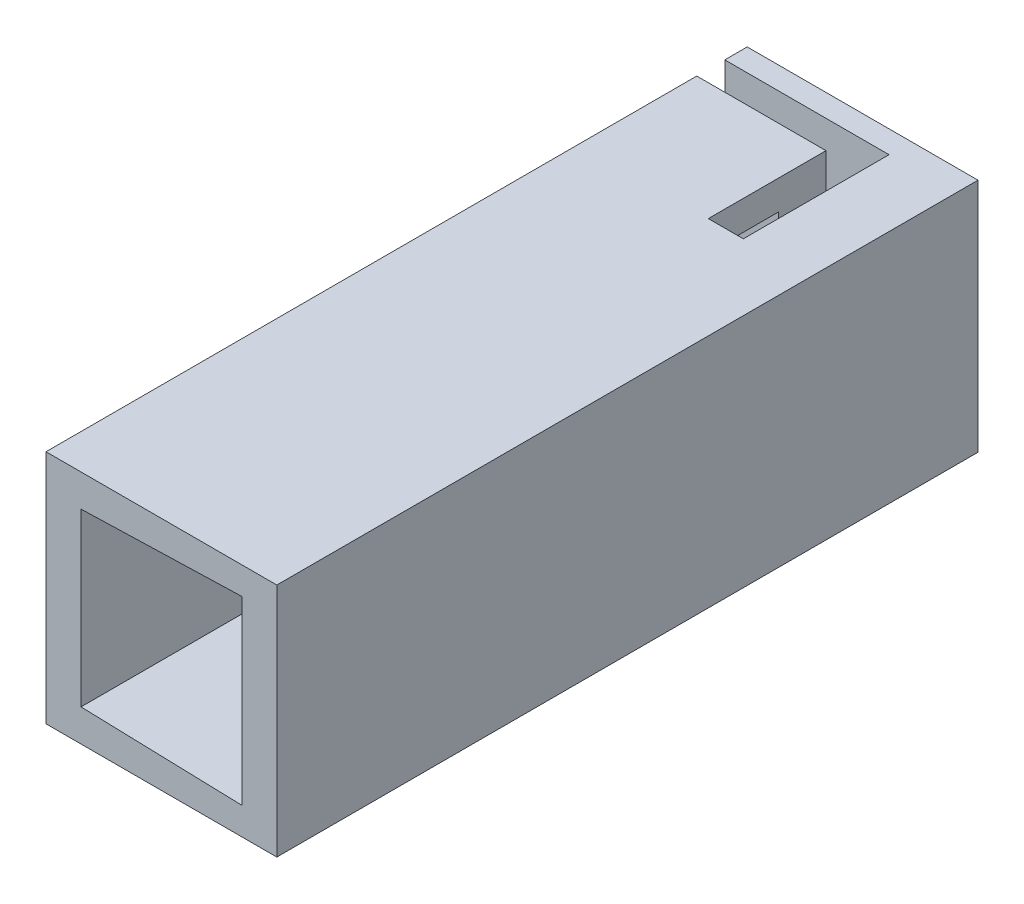
ISO-10303-21;
HEADER;
FILE_DESCRIPTION(('STEP AP214'),'2;1');
FILE_NAME('part.step','',(''),(''),'','','');
FILE_SCHEMA(('AUTOMOTIVE_DESIGN { 1 0 10303 214 1 1 1 1 }'));
ENDSEC;
DATA;
#1=APPLICATION_CONTEXT('core data for automotive mechanical design processes');
#2=APPLICATION_PROTOCOL_DEFINITION('international standard','automotive_design',2000,#1);
#3=PRODUCT_CONTEXT('',#1,'mechanical');
#4=PRODUCT('Part','Part','',(#3));
#5=PRODUCT_RELATED_PRODUCT_CATEGORY('part','',(#4));
#6=PRODUCT_DEFINITION_FORMATION('','',#4);
#7=PRODUCT_DEFINITION_CONTEXT('part definition',#1,'design');
#8=PRODUCT_DEFINITION('design','',#6,#7);
#9=PRODUCT_DEFINITION_SHAPE('','',#8);
#10=(LENGTH_UNIT() NAMED_UNIT(*) SI_UNIT(.MILLI.,.METRE.));
#11=(NAMED_UNIT(*) PLANE_ANGLE_UNIT() SI_UNIT($,.RADIAN.));
#12=(NAMED_UNIT(*) SI_UNIT($,.STERADIAN.) SOLID_ANGLE_UNIT());
#13=UNCERTAINTY_MEASURE_WITH_UNIT(LENGTH_MEASURE(1.E-05),#10,'distance_accuracy_value','');
#14=(GEOMETRIC_REPRESENTATION_CONTEXT(3) GLOBAL_UNCERTAINTY_ASSIGNED_CONTEXT((#13)) GLOBAL_UNIT_ASSIGNED_CONTEXT((#10,
#11,#12)) REPRESENTATION_CONTEXT('',''));
#15=CARTESIAN_POINT('',(0.,0.,0.));
#16=DIRECTION('',(0.,0.,1.));
#17=DIRECTION('',(1.,0.,0.));
#18=AXIS2_PLACEMENT_3D('',#15,#16,#17);
#19=CARTESIAN_POINT('',(0.,0.,86.1));
#20=DIRECTION('',(0.,0.,1.));
#21=DIRECTION('',(1.,0.,0.));
#22=AXIS2_PLACEMENT_3D('',#19,#20,#21);
#23=PLANE('',#22);
#24=DIRECTION('',(0.,1.,0.));
#25=VECTOR('',#24,1.);
#26=CARTESIAN_POINT('',(0.,33.6380158473369,86.1));
#27=LINE('',#26,#25);
#28=CARTESIAN_POINT('',(0.,0.,86.1));
#29=VERTEX_POINT('',#28);
#30=CARTESIAN_POINT('',(0.,33.6380158473369,86.1));
#31=VERTEX_POINT('',#30);
#32=EDGE_CURVE('E197',#29,#31,#27,.T.);
#33=ORIENTED_EDGE('',*,*,#32,.T.);
#34=DIRECTION('',(-1.,0.,0.));
#35=VECTOR('',#34,1.);
#36=CARTESIAN_POINT('',(-32.95,33.6380158473369,86.1));
#37=LINE('',#36,#35);
#38=CARTESIAN_POINT('',(-32.95,33.6380158473369,86.1));
#39=VERTEX_POINT('',#38);
#40=EDGE_CURVE('E199',#31,#39,#37,.T.);
#41=ORIENTED_EDGE('',*,*,#40,.T.);
#42=DIRECTION('',(0.,-1.,0.));
#43=VECTOR('',#42,1.);
#44=CARTESIAN_POINT('',(-32.95,33.6380158473369,86.1));
#45=LINE('',#44,#43);
#46=CARTESIAN_POINT('',(-32.95,0.,86.1));
#47=VERTEX_POINT('',#46);
#48=EDGE_CURVE('E201',#39,#47,#45,.T.);
#49=ORIENTED_EDGE('',*,*,#48,.T.);
#50=DIRECTION('',(1.,0.,0.));
#51=VECTOR('',#50,1.);
#52=CARTESIAN_POINT('',(-32.95,0.,86.1));
#53=LINE('',#52,#51);
#54=EDGE_CURVE('E60',#47,#29,#53,.T.);
#55=ORIENTED_EDGE('',*,*,#54,.T.);
#56=EDGE_LOOP('',(#33,#41,#49,#55));
#57=FACE_BOUND('',#56,.T.);
#58=DIRECTION('',(0.,1.,0.));
#59=VECTOR('',#58,1.);
#60=CARTESIAN_POINT('',(-5.,3.90900792366843,86.1));
#61=LINE('',#60,#59);
#62=CARTESIAN_POINT('',(-5.,3.90900792366843,86.1));
#63=VERTEX_POINT('',#62);
#64=CARTESIAN_POINT('',(-5.,29.7290079236684,86.1));
#65=VERTEX_POINT('',#64);
#66=EDGE_CURVE('E246',#63,#65,#61,.T.);
#67=ORIENTED_EDGE('',*,*,#66,.F.);
#68=DIRECTION('',(0.999555068005096,-0.0298272698269236,0.));
#69=VECTOR('',#68,1.);
#70=CARTESIAN_POINT('',(-27.95,4.59384847366843,86.1));
#71=LINE('',#70,#69);
#72=CARTESIAN_POINT('',(-27.95,4.59384847366843,86.1));
#73=VERTEX_POINT('',#72);
#74=EDGE_CURVE('E182',#73,#63,#71,.T.);
#75=ORIENTED_EDGE('',*,*,#74,.F.);
#76=DIRECTION('',(0.,-1.,0.));
#77=VECTOR('',#76,1.);
#78=CARTESIAN_POINT('',(-27.95,29.0441673736684,86.1));
#79=LINE('',#78,#77);
#80=CARTESIAN_POINT('',(-27.95,29.0441673736684,86.1));
#81=VERTEX_POINT('',#80);
#82=EDGE_CURVE('E190',#81,#73,#79,.T.);
#83=ORIENTED_EDGE('',*,*,#82,.F.);
#84=DIRECTION('',(-0.999555068005096,-0.0298272698269236,0.));
#85=VECTOR('',#84,1.);
#86=CARTESIAN_POINT('',(-27.95,29.0441673736684,86.1));
#87=LINE('',#86,#85);
#88=EDGE_CURVE('E248',#65,#81,#87,.T.);
#89=ORIENTED_EDGE('',*,*,#88,.F.);
#90=EDGE_LOOP('',(#67,#75,#83,#89));
#91=FACE_BOUND('',#90,.T.);
#92=ADVANCED_FACE('F37',(#57,#91),#23,.T.);
#93=CARTESIAN_POINT('',(0.,33.6380158473369,86.1));
#94=DIRECTION('',(-1.,0.,0.));
#95=DIRECTION('',(0.,0.,1.));
#96=AXIS2_PLACEMENT_3D('',#93,#94,#95);
#97=PLANE('',#96);
#98=DIRECTION('',(0.,0.,-1.));
#99=VECTOR('',#98,1.);
#100=CARTESIAN_POINT('',(0.,0.,86.1));
#101=LINE('',#100,#99);
#102=CARTESIAN_POINT('',(0.,0.,-14.));
#103=VERTEX_POINT('',#102);
#104=EDGE_CURVE('E204',#29,#103,#101,.T.);
#105=ORIENTED_EDGE('',*,*,#104,.T.);
#106=DIRECTION('',(0.,-1.,0.));
#107=VECTOR('',#106,1.);
#108=CARTESIAN_POINT('',(0.,33.6380158473369,-14.));
#109=LINE('',#108,#107);
#110=CARTESIAN_POINT('',(0.,33.6380158473369,-14.));
#111=VERTEX_POINT('',#110);
#112=EDGE_CURVE('E232',#111,#103,#109,.T.);
#113=ORIENTED_EDGE('',*,*,#112,.F.);
#114=DIRECTION('',(0.,0.,-1.));
#115=VECTOR('',#114,1.);
#116=CARTESIAN_POINT('',(0.,33.6380158473369,86.1));
#117=LINE('',#116,#115);
#118=EDGE_CURVE('E11',#31,#111,#117,.T.);
#119=ORIENTED_EDGE('',*,*,#118,.F.);
#120=ORIENTED_EDGE('',*,*,#32,.F.);
#121=EDGE_LOOP('',(#105,#113,#119,#120));
#122=FACE_BOUND('',#121,.T.);
#123=ADVANCED_FACE('F39',(#122),#97,.F.);
#124=CARTESIAN_POINT('',(-32.95,33.6380158473369,86.1));
#125=DIRECTION('',(0.,-1.,0.));
#126=DIRECTION('',(0.,0.,-1.));
#127=AXIS2_PLACEMENT_3D('',#124,#125,#126);
#128=PLANE('',#127);
#129=DIRECTION('',(1.,0.,0.));
#130=VECTOR('',#129,1.);
#131=CARTESIAN_POINT('',(-9.5,33.6380158473369,10.));
#132=LINE('',#131,#130);
#133=CARTESIAN_POINT('',(-14.5,33.6380158473369,10.));
#134=VERTEX_POINT('',#133);
#135=CARTESIAN_POINT('',(-9.5,33.6380158473369,10.));
#136=VERTEX_POINT('',#135);
#137=EDGE_CURVE('E162',#134,#136,#132,.T.);
#138=ORIENTED_EDGE('',*,*,#137,.F.);
#139=DIRECTION('',(0.,0.,1.));
#140=VECTOR('',#139,1.);
#141=CARTESIAN_POINT('',(-14.5,33.6380158473369,0.));
#142=LINE('',#141,#140);
#143=CARTESIAN_POINT('',(-14.5,33.6380158473369,-6.8));
#144=VERTEX_POINT('',#143);
#145=EDGE_CURVE('E231',#144,#134,#142,.T.);
#146=ORIENTED_EDGE('',*,*,#145,.F.);
#147=DIRECTION('',(-1.,0.,0.));
#148=VECTOR('',#147,1.);
#149=CARTESIAN_POINT('',(0.,33.6380158473369,-6.8));
#150=LINE('',#149,#148);
#151=CARTESIAN_POINT('',(-32.95,33.6380158473369,-6.8));
#152=VERTEX_POINT('',#151);
#153=EDGE_CURVE('E221',#144,#152,#150,.T.);
#154=ORIENTED_EDGE('',*,*,#153,.T.);
#155=DIRECTION('',(0.,0.,-1.));
#156=VECTOR('',#155,1.);
#157=CARTESIAN_POINT('',(-32.95,33.6380158473369,86.1));
#158=LINE('',#157,#156);
#159=EDGE_CURVE('E45',#39,#152,#158,.T.);
#160=ORIENTED_EDGE('',*,*,#159,.F.);
#161=ORIENTED_EDGE('',*,*,#40,.F.);
#162=ORIENTED_EDGE('',*,*,#118,.T.);
#163=DIRECTION('',(-1.,0.,0.));
#164=VECTOR('',#163,1.);
#165=CARTESIAN_POINT('',(0.,33.6380158473369,-14.));
#166=LINE('',#165,#164);
#167=CARTESIAN_POINT('',(-32.95,33.6380158473369,-14.));
#168=VERTEX_POINT('',#167);
#169=EDGE_CURVE('E359',#111,#168,#166,.T.);
#170=ORIENTED_EDGE('',*,*,#169,.T.);
#171=DIRECTION('',(0.,0.,1.));
#172=VECTOR('',#171,1.);
#173=CARTESIAN_POINT('',(-32.95,33.6380158473369,0.));
#174=LINE('',#173,#172);
#175=CARTESIAN_POINT('',(-32.95,33.6380158473369,-10.8));
#176=VERTEX_POINT('',#175);
#177=EDGE_CURVE('E363',#168,#176,#174,.T.);
#178=ORIENTED_EDGE('',*,*,#177,.T.);
#179=DIRECTION('',(-1.,0.,0.));
#180=VECTOR('',#179,1.);
#181=CARTESIAN_POINT('',(0.,33.6380158473369,-10.8));
#182=LINE('',#181,#180);
#183=CARTESIAN_POINT('',(-9.5,33.6380158473369,-10.8));
#184=VERTEX_POINT('',#183);
#185=EDGE_CURVE('E234',#184,#176,#182,.T.);
#186=ORIENTED_EDGE('',*,*,#185,.F.);
#187=DIRECTION('',(0.,0.,1.));
#188=VECTOR('',#187,1.);
#189=CARTESIAN_POINT('',(-9.5,33.6380158473369,0.));
#190=LINE('',#189,#188);
#191=EDGE_CURVE('E242',#184,#136,#190,.T.);
#192=ORIENTED_EDGE('',*,*,#191,.T.);
#193=EDGE_LOOP('',(#138,#146,#154,#160,#161,#162,#170,#178,#186,#192));
#194=FACE_BOUND('',#193,.T.);
#195=ADVANCED_FACE('F230',(#194),#128,.F.);
#196=CARTESIAN_POINT('',(-32.95,33.6380158473369,86.1));
#197=DIRECTION('',(1.,0.,0.));
#198=DIRECTION('',(0.,0.,-1.));
#199=AXIS2_PLACEMENT_3D('',#196,#197,#198);
#200=PLANE('',#199);
#201=ORIENTED_EDGE('',*,*,#159,.T.);
#202=DIRECTION('',(0.,-1.,0.));
#203=VECTOR('',#202,1.);
#204=CARTESIAN_POINT('',(-32.95,43.9190079236684,-6.8));
#205=LINE('',#204,#203);
#206=CARTESIAN_POINT('',(-32.95,10.8190079236684,-6.8));
#207=VERTEX_POINT('',#206);
#208=EDGE_CURVE('E214',#152,#207,#205,.T.);
#209=ORIENTED_EDGE('',*,*,#208,.T.);
#210=DIRECTION('',(0.,0.,-1.));
#211=VECTOR('',#210,1.);
#212=CARTESIAN_POINT('',(-32.95,10.8190079236684,0.));
#213=LINE('',#212,#211);
#214=CARTESIAN_POINT('',(-32.95,10.8190079236684,-10.8));
#215=VERTEX_POINT('',#214);
#216=EDGE_CURVE('E372',#207,#215,#213,.T.);
#217=ORIENTED_EDGE('',*,*,#216,.T.);
#218=DIRECTION('',(0.,-1.,0.));
#219=VECTOR('',#218,1.);
#220=CARTESIAN_POINT('',(-32.95,43.9190079236684,-10.8));
#221=LINE('',#220,#219);
#222=EDGE_CURVE('E225',#176,#215,#221,.T.);
#223=ORIENTED_EDGE('',*,*,#222,.F.);
#224=ORIENTED_EDGE('',*,*,#177,.F.);
#225=DIRECTION('',(0.,-1.,0.));
#226=VECTOR('',#225,1.);
#227=CARTESIAN_POINT('',(-32.95,33.6380158473369,-14.));
#228=LINE('',#227,#226);
#229=CARTESIAN_POINT('',(-32.95,0.,-14.));
#230=VERTEX_POINT('',#229);
#231=EDGE_CURVE('E237',#168,#230,#228,.T.);
#232=ORIENTED_EDGE('',*,*,#231,.T.);
#233=DIRECTION('',(0.,0.,-1.));
#234=VECTOR('',#233,1.);
#235=CARTESIAN_POINT('',(-32.95,0.,86.1));
#236=LINE('',#235,#234);
#237=EDGE_CURVE('E206',#47,#230,#236,.T.);
#238=ORIENTED_EDGE('',*,*,#237,.F.);
#239=ORIENTED_EDGE('',*,*,#48,.F.);
#240=EDGE_LOOP('',(#201,#209,#217,#223,#224,#232,#238,#239));
#241=FACE_BOUND('',#240,.T.);
#242=ADVANCED_FACE('F212',(#241),#200,.F.);
#243=CARTESIAN_POINT('',(-32.95,0.,86.1));
#244=DIRECTION('',(0.,1.,0.));
#245=DIRECTION('',(0.,0.,1.));
#246=AXIS2_PLACEMENT_3D('',#243,#244,#245);
#247=PLANE('',#246);
#248=ORIENTED_EDGE('',*,*,#237,.T.);
#249=DIRECTION('',(-1.,0.,0.));
#250=VECTOR('',#249,1.);
#251=CARTESIAN_POINT('',(0.,0.,-14.));
#252=LINE('',#251,#250);
#253=EDGE_CURVE('E354',#103,#230,#252,.T.);
#254=ORIENTED_EDGE('',*,*,#253,.F.);
#255=ORIENTED_EDGE('',*,*,#104,.F.);
#256=ORIENTED_EDGE('',*,*,#54,.F.);
#257=EDGE_LOOP('',(#248,#254,#255,#256));
#258=FACE_BOUND('',#257,.T.);
#259=ADVANCED_FACE('F287',(#258),#247,.F.);
#260=CARTESIAN_POINT('',(-27.95,4.59384847366843,86.1));
#261=DIRECTION('',(0.0298272698269236,0.999555068005096,0.));
#262=DIRECTION('',(-0.999555068005096,0.0298272698269236,0.));
#263=AXIS2_PLACEMENT_3D('',#260,#261,#262);
#264=PLANE('',#263);
#265=DIRECTION('',(0.999555068005096,-0.0298272698269236,0.));
#266=VECTOR('',#265,1.);
#267=CARTESIAN_POINT('',(-27.95,4.59384847366843,0.));
#268=LINE('',#267,#266);
#269=CARTESIAN_POINT('',(-27.95,4.59384847366843,0.));
#270=VERTEX_POINT('',#269);
#271=CARTESIAN_POINT('',(-5.,3.90900792366843,0.));
#272=VERTEX_POINT('',#271);
#273=EDGE_CURVE('E244',#270,#272,#268,.T.);
#274=ORIENTED_EDGE('',*,*,#273,.F.);
#275=DIRECTION('',(0.,0.,-1.));
#276=VECTOR('',#275,1.);
#277=CARTESIAN_POINT('',(-27.95,4.59384847366843,86.1));
#278=LINE('',#277,#276);
#279=EDGE_CURVE('E187',#73,#270,#278,.T.);
#280=ORIENTED_EDGE('',*,*,#279,.F.);
#281=ORIENTED_EDGE('',*,*,#74,.T.);
#282=DIRECTION('',(0.,0.,-1.));
#283=VECTOR('',#282,1.);
#284=CARTESIAN_POINT('',(-5.,3.90900792366843,86.1));
#285=LINE('',#284,#283);
#286=EDGE_CURVE('E194',#63,#272,#285,.T.);
#287=ORIENTED_EDGE('',*,*,#286,.T.);
#288=EDGE_LOOP('',(#274,#280,#281,#287));
#289=FACE_BOUND('',#288,.T.);
#290=ADVANCED_FACE('F257',(#289),#264,.T.);
#291=CARTESIAN_POINT('',(-5.,3.90900792366843,86.1));
#292=DIRECTION('',(-1.,0.,0.));
#293=DIRECTION('',(0.,0.,1.));
#294=AXIS2_PLACEMENT_3D('',#291,#292,#293);
#295=PLANE('',#294);
#296=DIRECTION('',(0.,1.,0.));
#297=VECTOR('',#296,1.);
#298=CARTESIAN_POINT('',(-5.,3.90900792366843,0.));
#299=LINE('',#298,#297);
#300=CARTESIAN_POINT('',(-5.,29.7290079236684,0.));
#301=VERTEX_POINT('',#300);
#302=EDGE_CURVE('E177',#272,#301,#299,.T.);
#303=ORIENTED_EDGE('',*,*,#302,.F.);
#304=ORIENTED_EDGE('',*,*,#286,.F.);
#305=ORIENTED_EDGE('',*,*,#66,.T.);
#306=DIRECTION('',(0.,0.,-1.));
#307=VECTOR('',#306,1.);
#308=CARTESIAN_POINT('',(-5.,29.7290079236684,86.1));
#309=LINE('',#308,#307);
#310=EDGE_CURVE('E192',#65,#301,#309,.T.);
#311=ORIENTED_EDGE('',*,*,#310,.T.);
#312=EDGE_LOOP('',(#303,#304,#305,#311));
#313=FACE_BOUND('',#312,.T.);
#314=ADVANCED_FACE('F255',(#313),#295,.T.);
#315=CARTESIAN_POINT('',(-27.95,29.0441673736684,86.1));
#316=DIRECTION('',(0.0298272698269236,-0.999555068005096,0.));
#317=DIRECTION('',(0.999555068005096,0.0298272698269236,0.));
#318=AXIS2_PLACEMENT_3D('',#315,#316,#317);
#319=PLANE('',#318);
#320=DIRECTION('',(0.,0.,1.));
#321=VECTOR('',#320,1.);
#322=CARTESIAN_POINT('',(-14.5,29.4455227286793,0.));
#323=LINE('',#322,#321);
#324=CARTESIAN_POINT('',(-14.5,29.4455227286793,0.));
#325=VERTEX_POINT('',#324);
#326=CARTESIAN_POINT('',(-14.5,29.4455227286793,10.));
#327=VERTEX_POINT('',#326);
#328=EDGE_CURVE('E390',#325,#327,#323,.T.);
#329=ORIENTED_EDGE('',*,*,#328,.T.);
#330=DIRECTION('',(0.999555068005096,0.0298272698269236,0.));
#331=VECTOR('',#330,1.);
#332=CARTESIAN_POINT('',(-10.3823669210755,29.5683951514449,10.));
#333=LINE('',#332,#331);
#334=CARTESIAN_POINT('',(-9.5,29.5947254628841,10.));
#335=VERTEX_POINT('',#334);
#336=EDGE_CURVE('E158',#327,#335,#333,.T.);
#337=ORIENTED_EDGE('',*,*,#336,.T.);
#338=DIRECTION('',(0.,0.,-1.));
#339=VECTOR('',#338,1.);
#340=CARTESIAN_POINT('',(-9.5,29.5947254628841,0.));
#341=LINE('',#340,#339);
#342=CARTESIAN_POINT('',(-9.5,29.5947254628841,0.));
#343=VERTEX_POINT('',#342);
#344=EDGE_CURVE('E151',#335,#343,#341,.T.);
#345=ORIENTED_EDGE('',*,*,#344,.T.);
#346=DIRECTION('',(-0.999555068005096,-0.0298272698269236,0.));
#347=VECTOR('',#346,1.);
#348=CARTESIAN_POINT('',(-27.95,29.0441673736684,0.));
#349=LINE('',#348,#347);
#350=EDGE_CURVE('E157',#301,#343,#349,.T.);
#351=ORIENTED_EDGE('',*,*,#350,.F.);
#352=ORIENTED_EDGE('',*,*,#310,.F.);
#353=ORIENTED_EDGE('',*,*,#88,.T.);
#354=DIRECTION('',(0.,0.,-1.));
#355=VECTOR('',#354,1.);
#356=CARTESIAN_POINT('',(-27.95,29.0441673736684,86.1));
#357=LINE('',#356,#355);
#358=CARTESIAN_POINT('',(-27.95,29.0441673736684,0.));
#359=VERTEX_POINT('',#358);
#360=EDGE_CURVE('E52',#81,#359,#357,.T.);
#361=ORIENTED_EDGE('',*,*,#360,.T.);
#362=EDGE_CURVE('E180',#325,#359,#349,.T.);
#363=ORIENTED_EDGE('',*,*,#362,.F.);
#364=EDGE_LOOP('',(#329,#337,#345,#351,#352,#353,#361,#363));
#365=FACE_BOUND('',#364,.T.);
#366=ADVANCED_FACE('F154',(#365),#319,.T.);
#367=CARTESIAN_POINT('',(-27.95,29.0441673736684,86.1));
#368=DIRECTION('',(1.,0.,0.));
#369=DIRECTION('',(0.,1.,0.));
#370=AXIS2_PLACEMENT_3D('',#367,#368,#369);
#371=PLANE('',#370);
#372=DIRECTION('',(0.,-1.,0.));
#373=VECTOR('',#372,1.);
#374=CARTESIAN_POINT('',(-27.95,29.0441673736684,0.));
#375=LINE('',#374,#373);
#376=EDGE_CURVE('E179',#359,#270,#375,.T.);
#377=ORIENTED_EDGE('',*,*,#376,.F.);
#378=ORIENTED_EDGE('',*,*,#360,.F.);
#379=ORIENTED_EDGE('',*,*,#82,.T.);
#380=ORIENTED_EDGE('',*,*,#279,.T.);
#381=EDGE_LOOP('',(#377,#378,#379,#380));
#382=FACE_BOUND('',#381,.T.);
#383=ADVANCED_FACE('F263',(#382),#371,.T.);
#384=CARTESIAN_POINT('',(0.,33.6380158473369,0.));
#385=DIRECTION('',(0.,0.,-1.));
#386=DIRECTION('',(-1.,0.,0.));
#387=AXIS2_PLACEMENT_3D('',#384,#385,#386);
#388=PLANE('',#387);
#389=ORIENTED_EDGE('',*,*,#302,.T.);
#390=ORIENTED_EDGE('',*,*,#350,.T.);
#391=DIRECTION('',(0.,-1.,0.));
#392=VECTOR('',#391,1.);
#393=CARTESIAN_POINT('',(-9.5,43.9190079236684,0.));
#394=LINE('',#393,#392);
#395=CARTESIAN_POINT('',(-9.5,10.8190079236684,0.));
#396=VERTEX_POINT('',#395);
#397=EDGE_CURVE('E165',#343,#396,#394,.T.);
#398=ORIENTED_EDGE('',*,*,#397,.T.);
#399=DIRECTION('',(-1.,0.,0.));
#400=VECTOR('',#399,1.);
#401=CARTESIAN_POINT('',(0.,10.8190079236684,0.));
#402=LINE('',#401,#400);
#403=CARTESIAN_POINT('',(-14.5,10.8190079236684,0.));
#404=VERTEX_POINT('',#403);
#405=EDGE_CURVE('E378',#396,#404,#402,.T.);
#406=ORIENTED_EDGE('',*,*,#405,.T.);
#407=DIRECTION('',(0.,-1.,0.));
#408=VECTOR('',#407,1.);
#409=CARTESIAN_POINT('',(-14.5,43.9190079236684,0.));
#410=LINE('',#409,#408);
#411=EDGE_CURVE('E172',#325,#404,#410,.T.);
#412=ORIENTED_EDGE('',*,*,#411,.F.);
#413=ORIENTED_EDGE('',*,*,#362,.T.);
#414=ORIENTED_EDGE('',*,*,#376,.T.);
#415=ORIENTED_EDGE('',*,*,#273,.T.);
#416=EDGE_LOOP('',(#389,#390,#398,#406,#412,#413,#414,#415));
#417=FACE_BOUND('',#416,.T.);
#418=ADVANCED_FACE('F175',(#417),#388,.F.);
#419=CARTESIAN_POINT('',(0.,33.6380158473369,-14.));
#420=DIRECTION('',(0.,0.,1.));
#421=DIRECTION('',(1.,0.,0.));
#422=AXIS2_PLACEMENT_3D('',#419,#420,#421);
#423=PLANE('',#422);
#424=ORIENTED_EDGE('',*,*,#253,.T.);
#425=ORIENTED_EDGE('',*,*,#231,.F.);
#426=ORIENTED_EDGE('',*,*,#169,.F.);
#427=ORIENTED_EDGE('',*,*,#112,.T.);
#428=EDGE_LOOP('',(#424,#425,#426,#427));
#429=FACE_BOUND('',#428,.T.);
#430=ADVANCED_FACE('F270',(#429),#423,.F.);
#431=CARTESIAN_POINT('',(-14.5,43.9190079236684,0.));
#432=DIRECTION('',(-1.,0.,0.));
#433=DIRECTION('',(0.,0.,1.));
#434=AXIS2_PLACEMENT_3D('',#431,#432,#433);
#435=PLANE('',#434);
#436=ORIENTED_EDGE('',*,*,#145,.T.);
#437=DIRECTION('',(0.,1.,0.));
#438=VECTOR('',#437,1.);
#439=CARTESIAN_POINT('',(-14.5,-0.001000000000001,10.));
#440=LINE('',#439,#438);
#441=EDGE_CURVE('E384',#327,#134,#440,.T.);
#442=ORIENTED_EDGE('',*,*,#441,.F.);
#443=ORIENTED_EDGE('',*,*,#328,.F.);
#444=ORIENTED_EDGE('',*,*,#411,.T.);
#445=DIRECTION('',(0.,0.,-1.));
#446=VECTOR('',#445,1.);
#447=CARTESIAN_POINT('',(-14.5,10.8190079236684,0.));
#448=LINE('',#447,#446);
#449=CARTESIAN_POINT('',(-14.5,10.8190079236684,-6.8));
#450=VERTEX_POINT('',#449);
#451=EDGE_CURVE('E380',#404,#450,#448,.T.);
#452=ORIENTED_EDGE('',*,*,#451,.T.);
#453=DIRECTION('',(0.,-1.,0.));
#454=VECTOR('',#453,1.);
#455=CARTESIAN_POINT('',(-14.5,43.9190079236684,-6.8));
#456=LINE('',#455,#454);
#457=EDGE_CURVE('E226',#144,#450,#456,.T.);
#458=ORIENTED_EDGE('',*,*,#457,.F.);
#459=EDGE_LOOP('',(#436,#442,#443,#444,#452,#458));
#460=FACE_BOUND('',#459,.T.);
#461=ADVANCED_FACE('F309',(#460),#435,.F.);
#462=CARTESIAN_POINT('',(-9.5,43.9190079236684,0.));
#463=DIRECTION('',(-1.,0.,0.));
#464=DIRECTION('',(0.,0.,1.));
#465=AXIS2_PLACEMENT_3D('',#462,#463,#464);
#466=PLANE('',#465);
#467=DIRECTION('',(0.,-1.,0.));
#468=VECTOR('',#467,1.);
#469=CARTESIAN_POINT('',(-9.5,43.9190079236684,-10.8));
#470=LINE('',#469,#468);
#471=CARTESIAN_POINT('',(-9.5,10.8190079236684,-10.8));
#472=VERTEX_POINT('',#471);
#473=EDGE_CURVE('E173',#184,#472,#470,.T.);
#474=ORIENTED_EDGE('',*,*,#473,.T.);
#475=DIRECTION('',(0.,0.,-1.));
#476=VECTOR('',#475,1.);
#477=CARTESIAN_POINT('',(-9.5,10.8190079236684,0.));
#478=LINE('',#477,#476);
#479=EDGE_CURVE('E168',#396,#472,#478,.T.);
#480=ORIENTED_EDGE('',*,*,#479,.F.);
#481=ORIENTED_EDGE('',*,*,#397,.F.);
#482=ORIENTED_EDGE('',*,*,#344,.F.);
#483=DIRECTION('',(0.,1.,0.));
#484=VECTOR('',#483,1.);
#485=CARTESIAN_POINT('',(-9.5,-0.001000000000001,10.));
#486=LINE('',#485,#484);
#487=EDGE_CURVE('E383',#335,#136,#486,.T.);
#488=ORIENTED_EDGE('',*,*,#487,.T.);
#489=ORIENTED_EDGE('',*,*,#191,.F.);
#490=EDGE_LOOP('',(#474,#480,#481,#482,#488,#489));
#491=FACE_BOUND('',#490,.T.);
#492=ADVANCED_FACE('F166',(#491),#466,.T.);
#493=CARTESIAN_POINT('',(0.,43.9190079236684,-10.8));
#494=DIRECTION('',(0.,0.,-1.));
#495=DIRECTION('',(-1.,0.,0.));
#496=AXIS2_PLACEMENT_3D('',#493,#494,#495);
#497=PLANE('',#496);
#498=ORIENTED_EDGE('',*,*,#185,.T.);
#499=ORIENTED_EDGE('',*,*,#222,.T.);
#500=DIRECTION('',(1.,0.,0.));
#501=VECTOR('',#500,1.);
#502=CARTESIAN_POINT('',(0.,10.8190079236684,-10.8));
#503=LINE('',#502,#501);
#504=EDGE_CURVE('E374',#215,#472,#503,.T.);
#505=ORIENTED_EDGE('',*,*,#504,.T.);
#506=ORIENTED_EDGE('',*,*,#473,.F.);
#507=EDGE_LOOP('',(#498,#499,#505,#506));
#508=FACE_BOUND('',#507,.T.);
#509=ADVANCED_FACE('F326',(#508),#497,.F.);
#510=CARTESIAN_POINT('',(0.,43.9190079236684,-6.8));
#511=DIRECTION('',(0.,0.,-1.));
#512=DIRECTION('',(-1.,0.,0.));
#513=AXIS2_PLACEMENT_3D('',#510,#511,#512);
#514=PLANE('',#513);
#515=ORIENTED_EDGE('',*,*,#457,.T.);
#516=DIRECTION('',(1.,0.,0.));
#517=VECTOR('',#516,1.);
#518=CARTESIAN_POINT('',(0.,10.8190079236684,-6.8));
#519=LINE('',#518,#517);
#520=EDGE_CURVE('E224',#207,#450,#519,.T.);
#521=ORIENTED_EDGE('',*,*,#520,.F.);
#522=ORIENTED_EDGE('',*,*,#208,.F.);
#523=ORIENTED_EDGE('',*,*,#153,.F.);
#524=EDGE_LOOP('',(#515,#521,#522,#523));
#525=FACE_BOUND('',#524,.T.);
#526=ADVANCED_FACE('F220',(#525),#514,.T.);
#527=CARTESIAN_POINT('',(0.,10.8190079236684,0.));
#528=DIRECTION('',(0.,1.,0.));
#529=DIRECTION('',(0.,0.,1.));
#530=AXIS2_PLACEMENT_3D('',#527,#528,#529);
#531=PLANE('',#530);
#532=ORIENTED_EDGE('',*,*,#451,.F.);
#533=ORIENTED_EDGE('',*,*,#405,.F.);
#534=ORIENTED_EDGE('',*,*,#479,.T.);
#535=ORIENTED_EDGE('',*,*,#504,.F.);
#536=ORIENTED_EDGE('',*,*,#216,.F.);
#537=ORIENTED_EDGE('',*,*,#520,.T.);
#538=EDGE_LOOP('',(#532,#533,#534,#535,#536,#537));
#539=FACE_BOUND('',#538,.T.);
#540=ADVANCED_FACE('F297',(#539),#531,.T.);
#541=CARTESIAN_POINT('',(-9.5,-0.001000000000001,10.));
#542=DIRECTION('',(0.,0.,1.));
#543=DIRECTION('',(1.,0.,0.));
#544=AXIS2_PLACEMENT_3D('',#541,#542,#543);
#545=PLANE('',#544);
#546=ORIENTED_EDGE('',*,*,#441,.T.);
#547=ORIENTED_EDGE('',*,*,#137,.T.);
#548=ORIENTED_EDGE('',*,*,#487,.F.);
#549=ORIENTED_EDGE('',*,*,#336,.F.);
#550=EDGE_LOOP('',(#546,#547,#548,#549));
#551=FACE_BOUND('',#550,.T.);
#552=ADVANCED_FACE('F334',(#551),#545,.F.);
#553=CLOSED_SHELL('',(#92,#123,#195,#242,#259,#290,#314,#366,#383,#418,#430,#461,#492,#509,#526,
#540,#552));
#554=MANIFOLD_SOLID_BREP('B2',#553);
#555=ADVANCED_BREP_SHAPE_REPRESENTATION('',(#18,#554),#14);
#556=SHAPE_DEFINITION_REPRESENTATION(#9,#555);
ENDSEC;
END-ISO-10303-21;
